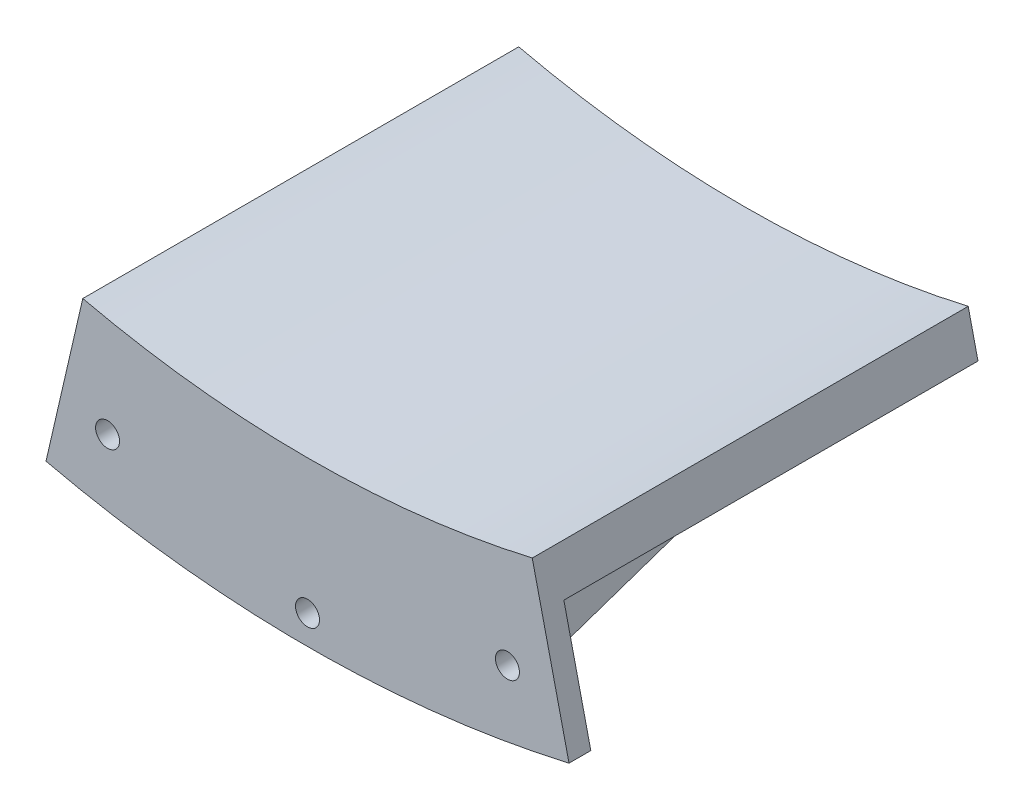
ISO-10303-21;
HEADER;
FILE_DESCRIPTION(('STEP AP214'),'2;1');
FILE_NAME('part.step','',(''),(''),'','','');
FILE_SCHEMA(('AUTOMOTIVE_DESIGN { 1 0 10303 214 1 1 1 1 }'));
ENDSEC;
DATA;
#1=APPLICATION_CONTEXT('core data for automotive mechanical design processes');
#2=APPLICATION_PROTOCOL_DEFINITION('international standard','automotive_design',2000,#1);
#3=PRODUCT_CONTEXT('',#1,'mechanical');
#4=PRODUCT('Part','Part','',(#3));
#5=PRODUCT_RELATED_PRODUCT_CATEGORY('part','',(#4));
#6=PRODUCT_DEFINITION_FORMATION('','',#4);
#7=PRODUCT_DEFINITION_CONTEXT('part definition',#1,'design');
#8=PRODUCT_DEFINITION('design','',#6,#7);
#9=PRODUCT_DEFINITION_SHAPE('','',#8);
#10=(LENGTH_UNIT() NAMED_UNIT(*) SI_UNIT(.MILLI.,.METRE.));
#11=(NAMED_UNIT(*) PLANE_ANGLE_UNIT() SI_UNIT($,.RADIAN.));
#12=(NAMED_UNIT(*) SI_UNIT($,.STERADIAN.) SOLID_ANGLE_UNIT());
#13=UNCERTAINTY_MEASURE_WITH_UNIT(LENGTH_MEASURE(1.E-05),#10,'distance_accuracy_value','');
#14=(GEOMETRIC_REPRESENTATION_CONTEXT(3) GLOBAL_UNCERTAINTY_ASSIGNED_CONTEXT((#13)) GLOBAL_UNIT_ASSIGNED_CONTEXT((#10,
#11,#12)) REPRESENTATION_CONTEXT('',''));
#15=CARTESIAN_POINT('',(0.,0.,0.));
#16=DIRECTION('',(0.,0.,1.));
#17=DIRECTION('',(1.,0.,0.));
#18=AXIS2_PLACEMENT_3D('',#15,#16,#17);
#19=CARTESIAN_POINT('',(0.,0.,60.));
#20=DIRECTION('',(0.,0.,-1.));
#21=DIRECTION('',(-1.,0.,0.));
#22=AXIS2_PLACEMENT_3D('',#19,#20,#21);
#23=CYLINDRICAL_SURFACE('',#22,143.5);
#24=DIRECTION('',(0.,0.,1.));
#25=VECTOR('',#24,1.);
#26=CARTESIAN_POINT('',(-14.5015786457528,-142.765381716931,0.));
#27=LINE('',#26,#25);
#28=CARTESIAN_POINT('',(-14.5015786457528,-142.765381716931,0.));
#29=VERTEX_POINT('',#28);
#30=CARTESIAN_POINT('',(-14.5015786457528,-142.765381716931,57.));
#31=VERTEX_POINT('',#30);
#32=EDGE_CURVE('E147',#29,#31,#27,.T.);
#33=ORIENTED_EDGE('',*,*,#32,.F.);
#34=CARTESIAN_POINT('',(0.,0.,0.));
#35=DIRECTION('',(0.,0.,1.));
#36=DIRECTION('',(1.,0.,0.));
#37=AXIS2_PLACEMENT_3D('',#34,#35,#36);
#38=CIRCLE('',#37,143.5);
#39=CARTESIAN_POINT('',(14.5015786457528,-142.765381716931,0.));
#40=VERTEX_POINT('',#39);
#41=EDGE_CURVE('E106',#29,#40,#38,.T.);
#42=ORIENTED_EDGE('',*,*,#41,.T.);
#43=DIRECTION('',(0.,0.,1.));
#44=VECTOR('',#43,1.);
#45=CARTESIAN_POINT('',(14.5015786457528,-142.765381716931,0.));
#46=LINE('',#45,#44);
#47=CARTESIAN_POINT('',(14.5015786457528,-142.765381716931,57.));
#48=VERTEX_POINT('',#47);
#49=EDGE_CURVE('E144',#40,#48,#46,.T.);
#50=ORIENTED_EDGE('',*,*,#49,.T.);
#51=CARTESIAN_POINT('',(0.,0.,57.));
#52=DIRECTION('',(0.,0.,1.));
#53=DIRECTION('',(1.,0.,0.));
#54=AXIS2_PLACEMENT_3D('',#51,#52,#53);
#55=CIRCLE('',#54,143.5);
#56=EDGE_CURVE('E182',#31,#48,#55,.T.);
#57=ORIENTED_EDGE('',*,*,#56,.F.);
#58=EDGE_LOOP('',(#33,#42,#50,#57));
#59=FACE_BOUND('',#58,.T.);
#60=ADVANCED_FACE('F36',(#59),#23,.T.);
#61=CARTESIAN_POINT('',(0.,0.,57.));
#62=DIRECTION('',(0.,0.,1.));
#63=DIRECTION('',(1.,0.,0.));
#64=AXIS2_PLACEMENT_3D('',#61,#62,#63);
#65=PLANE('',#64);
#66=CARTESIAN_POINT('',(0.,-156.,57.));
#67=DIRECTION('',(0.,0.,1.));
#68=DIRECTION('',(1.,0.,0.));
#69=AXIS2_PLACEMENT_3D('',#66,#67,#68);
#70=CIRCLE('',#69,1.65000000000001);
#71=CARTESIAN_POINT('',(1.64999999999999,-156.,57.));
#72=VERTEX_POINT('',#71);
#73=EDGE_CURVE('E249',#72,#72,#70,.T.);
#74=ORIENTED_EDGE('',*,*,#73,.T.);
#75=EDGE_LOOP('',(#74));
#76=FACE_BOUND('',#75,.T.);
#77=DIRECTION('',(-0.101056297182946,-0.994880708828788,0.));
#78=VECTOR('',#77,1.);
#79=CARTESIAN_POINT('',(0.,0.,57.));
#80=LINE('',#79,#78);
#81=CARTESIAN_POINT('',(-16.1690075492714,-159.180913412606,57.));
#82=VERTEX_POINT('',#81);
#83=EDGE_CURVE('E244',#31,#82,#80,.T.);
#84=ORIENTED_EDGE('',*,*,#83,.F.);
#85=ORIENTED_EDGE('',*,*,#56,.T.);
#86=DIRECTION('',(0.101056297182946,-0.994880708828788,0.));
#87=VECTOR('',#86,1.);
#88=CARTESIAN_POINT('',(0.,0.,57.));
#89=LINE('',#88,#87);
#90=CARTESIAN_POINT('',(16.1690075492714,-159.180913412606,57.));
#91=VERTEX_POINT('',#90);
#92=EDGE_CURVE('E159',#48,#91,#89,.T.);
#93=ORIENTED_EDGE('',*,*,#92,.T.);
#94=CARTESIAN_POINT('',(0.,0.,57.));
#95=DIRECTION('',(0.,0.,1.));
#96=DIRECTION('',(1.,0.,0.));
#97=AXIS2_PLACEMENT_3D('',#94,#95,#96);
#98=CIRCLE('',#97,160.);
#99=EDGE_CURVE('E175',#82,#91,#98,.T.);
#100=ORIENTED_EDGE('',*,*,#99,.F.);
#101=EDGE_LOOP('',(#84,#85,#93,#100));
#102=FACE_BOUND('',#101,.T.);
#103=ADVANCED_FACE('F264',(#76,#102),#65,.F.);
#104=DIRECTION('',(0.,0.,1.));
#105=VECTOR('',#104,1.);
#106=CARTESIAN_POINT('',(19.9713399877694,-142.103467864415,0.));
#107=LINE('',#106,#105);
#108=CARTESIAN_POINT('',(19.9713399877694,-142.103467864415,0.));
#109=VERTEX_POINT('',#108);
#110=CARTESIAN_POINT('',(19.9713399877694,-142.103467864415,57.));
#111=VERTEX_POINT('',#110);
#112=EDGE_CURVE('E160',#109,#111,#107,.T.);
#113=ORIENTED_EDGE('',*,*,#112,.F.);
#114=CARTESIAN_POINT('',(32.2804762983447,-139.822104296681,0.));
#115=VERTEX_POINT('',#114);
#116=EDGE_CURVE('E108',#109,#115,#38,.T.);
#117=ORIENTED_EDGE('',*,*,#116,.T.);
#118=DIRECTION('',(0.,0.,-1.));
#119=VECTOR('',#118,1.);
#120=CARTESIAN_POINT('',(32.2804762983447,-139.822104296681,60.));
#121=LINE('',#120,#119);
#122=CARTESIAN_POINT('',(32.2804762983447,-139.822104296681,57.));
#123=VERTEX_POINT('',#122);
#124=EDGE_CURVE('E83',#123,#115,#121,.T.);
#125=ORIENTED_EDGE('',*,*,#124,.F.);
#126=EDGE_CURVE('E178',#111,#123,#55,.T.);
#127=ORIENTED_EDGE('',*,*,#126,.F.);
#128=EDGE_LOOP('',(#113,#117,#125,#127));
#129=FACE_BOUND('',#128,.T.);
#130=ADVANCED_FACE('F266',(#129),#23,.T.);
#131=CARTESIAN_POINT('',(27.5175643493143,-148.471491042157,57.));
#132=DIRECTION('',(0.,0.,1.));
#133=DIRECTION('',(1.,0.,0.));
#134=AXIS2_PLACEMENT_3D('',#131,#132,#133);
#135=CIRCLE('',#134,1.64999999999998);
#136=CARTESIAN_POINT('',(29.1675643493143,-148.471491042157,57.));
#137=VERTEX_POINT('',#136);
#138=EDGE_CURVE('E245',#137,#137,#135,.T.);
#139=ORIENTED_EDGE('',*,*,#138,.T.);
#140=EDGE_LOOP('',(#139));
#141=FACE_BOUND('',#140,.T.);
#142=DIRECTION('',(0.139173100960066,-0.99026806874157,0.));
#143=VECTOR('',#142,1.);
#144=CARTESIAN_POINT('',(0.,0.,57.));
#145=LINE('',#144,#143);
#146=CARTESIAN_POINT('',(22.2676961536105,-158.442890998651,57.));
#147=VERTEX_POINT('',#146);
#148=EDGE_CURVE('E164',#111,#147,#145,.T.);
#149=ORIENTED_EDGE('',*,*,#148,.F.);
#150=ORIENTED_EDGE('',*,*,#126,.T.);
#151=DIRECTION('',(0.224951054343866,-0.974370064785235,0.));
#152=VECTOR('',#151,1.);
#153=CARTESIAN_POINT('',(0.,0.,57.));
#154=LINE('',#153,#152);
#155=CARTESIAN_POINT('',(35.9921686950185,-155.899210365638,57.));
#156=VERTEX_POINT('',#155);
#157=EDGE_CURVE('E174',#123,#156,#154,.T.);
#158=ORIENTED_EDGE('',*,*,#157,.T.);
#159=EDGE_CURVE('E170',#147,#156,#98,.T.);
#160=ORIENTED_EDGE('',*,*,#159,.F.);
#161=EDGE_LOOP('',(#149,#150,#158,#160));
#162=FACE_BOUND('',#161,.T.);
#163=ADVANCED_FACE('F262',(#141,#162),#65,.F.);
#164=CARTESIAN_POINT('',(-32.2804762983447,-139.822104296681,0.));
#165=VERTEX_POINT('',#164);
#166=CARTESIAN_POINT('',(-19.9713399877694,-142.103467864415,0.));
#167=VERTEX_POINT('',#166);
#168=EDGE_CURVE('E101',#165,#167,#38,.T.);
#169=ORIENTED_EDGE('',*,*,#168,.T.);
#170=DIRECTION('',(0.,0.,1.));
#171=VECTOR('',#170,1.);
#172=CARTESIAN_POINT('',(-19.9713399877694,-142.103467864415,0.));
#173=LINE('',#172,#171);
#174=CARTESIAN_POINT('',(-19.9713399877694,-142.103467864415,57.));
#175=VERTEX_POINT('',#174);
#176=EDGE_CURVE('E238',#167,#175,#173,.T.);
#177=ORIENTED_EDGE('',*,*,#176,.T.);
#178=CARTESIAN_POINT('',(-32.2804762983447,-139.822104296681,57.));
#179=VERTEX_POINT('',#178);
#180=EDGE_CURVE('E179',#179,#175,#55,.T.);
#181=ORIENTED_EDGE('',*,*,#180,.F.);
#182=DIRECTION('',(0.,0.,-1.));
#183=VECTOR('',#182,1.);
#184=CARTESIAN_POINT('',(-32.2804762983447,-139.822104296681,60.));
#185=LINE('',#184,#183);
#186=EDGE_CURVE('E112',#179,#165,#185,.T.);
#187=ORIENTED_EDGE('',*,*,#186,.T.);
#188=EDGE_LOOP('',(#169,#177,#181,#187));
#189=FACE_BOUND('',#188,.T.);
#190=ADVANCED_FACE('F274',(#189),#23,.T.);
#191=CARTESIAN_POINT('',(0.,0.,60.));
#192=DIRECTION('',(0.,0.,-1.));
#193=DIRECTION('',(-1.,0.,0.));
#194=AXIS2_PLACEMENT_3D('',#191,#192,#193);
#195=CYLINDRICAL_SURFACE('',#194,137.5);
#196=CARTESIAN_POINT('',(0.,0.,0.));
#197=DIRECTION('',(0.,0.,1.));
#198=DIRECTION('',(1.,0.,0.));
#199=AXIS2_PLACEMENT_3D('',#196,#197,#198);
#200=CIRCLE('',#199,137.5);
#201=CARTESIAN_POINT('',(-30.9307699722815,-133.97588390797,0.));
#202=VERTEX_POINT('',#201);
#203=CARTESIAN_POINT('',(30.9307699722815,-133.97588390797,0.));
#204=VERTEX_POINT('',#203);
#205=EDGE_CURVE('E79',#202,#204,#200,.T.);
#206=ORIENTED_EDGE('',*,*,#205,.F.);
#207=DIRECTION('',(0.,0.,-1.));
#208=VECTOR('',#207,1.);
#209=CARTESIAN_POINT('',(-30.9307699722815,-133.97588390797,60.));
#210=LINE('',#209,#208);
#211=CARTESIAN_POINT('',(-30.9307699722815,-133.97588390797,60.));
#212=VERTEX_POINT('',#211);
#213=EDGE_CURVE('E44',#212,#202,#210,.T.);
#214=ORIENTED_EDGE('',*,*,#213,.F.);
#215=CARTESIAN_POINT('',(0.,0.,60.));
#216=DIRECTION('',(0.,0.,1.));
#217=DIRECTION('',(1.,0.,0.));
#218=AXIS2_PLACEMENT_3D('',#215,#216,#217);
#219=CIRCLE('',#218,137.5);
#220=CARTESIAN_POINT('',(30.9307699722815,-133.97588390797,60.));
#221=VERTEX_POINT('',#220);
#222=EDGE_CURVE('E81',#212,#221,#219,.T.);
#223=ORIENTED_EDGE('',*,*,#222,.T.);
#224=DIRECTION('',(0.,0.,-1.));
#225=VECTOR('',#224,1.);
#226=CARTESIAN_POINT('',(30.9307699722815,-133.97588390797,60.));
#227=LINE('',#226,#225);
#228=EDGE_CURVE('E60',#221,#204,#227,.T.);
#229=ORIENTED_EDGE('',*,*,#228,.T.);
#230=EDGE_LOOP('',(#206,#214,#223,#229));
#231=FACE_BOUND('',#230,.T.);
#232=ADVANCED_FACE('F38',(#231),#195,.F.);
#233=CARTESIAN_POINT('',(0.,0.,60.));
#234=DIRECTION('',(0.974370064785235,-0.224951054343865,0.));
#235=DIRECTION('',(0.224951054343865,0.974370064785235,0.));
#236=AXIS2_PLACEMENT_3D('',#233,#234,#235);
#237=PLANE('',#236);
#238=DIRECTION('',(-0.224951054343865,-0.974370064785235,0.));
#239=VECTOR('',#238,1.);
#240=CARTESIAN_POINT('',(0.,0.,0.));
#241=LINE('',#240,#239);
#242=EDGE_CURVE('E94',#202,#165,#241,.T.);
#243=ORIENTED_EDGE('',*,*,#242,.T.);
#244=ORIENTED_EDGE('',*,*,#186,.F.);
#245=DIRECTION('',(-0.224951054343865,-0.974370064785235,0.));
#246=VECTOR('',#245,1.);
#247=CARTESIAN_POINT('',(0.,0.,57.));
#248=LINE('',#247,#246);
#249=CARTESIAN_POINT('',(-35.9921686950184,-155.899210365638,57.));
#250=VERTEX_POINT('',#249);
#251=EDGE_CURVE('E168',#179,#250,#248,.T.);
#252=ORIENTED_EDGE('',*,*,#251,.T.);
#253=DIRECTION('',(0.,0.,1.));
#254=VECTOR('',#253,1.);
#255=CARTESIAN_POINT('',(-35.9921686950184,-155.899210365638,57.));
#256=LINE('',#255,#254);
#257=CARTESIAN_POINT('',(-35.9921686950184,-155.899210365638,60.));
#258=VERTEX_POINT('',#257);
#259=EDGE_CURVE('E122',#250,#258,#256,.T.);
#260=ORIENTED_EDGE('',*,*,#259,.T.);
#261=DIRECTION('',(-0.224951054343865,-0.974370064785235,0.));
#262=VECTOR('',#261,1.);
#263=CARTESIAN_POINT('',(0.,0.,60.));
#264=LINE('',#263,#262);
#265=EDGE_CURVE('E103',#212,#258,#264,.T.);
#266=ORIENTED_EDGE('',*,*,#265,.F.);
#267=ORIENTED_EDGE('',*,*,#213,.T.);
#268=EDGE_LOOP('',(#243,#244,#252,#260,#266,#267));
#269=FACE_BOUND('',#268,.T.);
#270=ADVANCED_FACE('F115',(#269),#237,.F.);
#271=CARTESIAN_POINT('',(0.,0.,60.));
#272=DIRECTION('',(0.974370064785235,0.224951054343866,0.));
#273=DIRECTION('',(-0.224951054343866,0.974370064785235,0.));
#274=AXIS2_PLACEMENT_3D('',#271,#272,#273);
#275=PLANE('',#274);
#276=DIRECTION('',(0.224951054343866,-0.974370064785235,0.));
#277=VECTOR('',#276,1.);
#278=CARTESIAN_POINT('',(0.,0.,0.));
#279=LINE('',#278,#277);
#280=EDGE_CURVE('E91',#204,#115,#279,.T.);
#281=ORIENTED_EDGE('',*,*,#280,.F.);
#282=ORIENTED_EDGE('',*,*,#228,.F.);
#283=DIRECTION('',(0.224951054343866,-0.974370064785235,0.));
#284=VECTOR('',#283,1.);
#285=CARTESIAN_POINT('',(0.,0.,60.));
#286=LINE('',#285,#284);
#287=CARTESIAN_POINT('',(35.9921686950185,-155.899210365638,60.));
#288=VERTEX_POINT('',#287);
#289=EDGE_CURVE('E84',#221,#288,#286,.T.);
#290=ORIENTED_EDGE('',*,*,#289,.T.);
#291=DIRECTION('',(0.,0.,1.));
#292=VECTOR('',#291,1.);
#293=CARTESIAN_POINT('',(35.9921686950185,-155.899210365638,57.));
#294=LINE('',#293,#292);
#295=EDGE_CURVE('E95',#156,#288,#294,.T.);
#296=ORIENTED_EDGE('',*,*,#295,.F.);
#297=ORIENTED_EDGE('',*,*,#157,.F.);
#298=ORIENTED_EDGE('',*,*,#124,.T.);
#299=EDGE_LOOP('',(#281,#282,#290,#296,#297,#298));
#300=FACE_BOUND('',#299,.T.);
#301=ADVANCED_FACE('F98',(#300),#275,.T.);
#302=CARTESIAN_POINT('',(0.,0.,60.));
#303=DIRECTION('',(0.,0.,1.));
#304=DIRECTION('',(1.,0.,0.));
#305=AXIS2_PLACEMENT_3D('',#302,#303,#304);
#306=PLANE('',#305);
#307=CARTESIAN_POINT('',(27.5175643493143,-148.471491042157,60.));
#308=DIRECTION('',(0.,0.,-1.));
#309=DIRECTION('',(-1.,0.,0.));
#310=AXIS2_PLACEMENT_3D('',#307,#308,#309);
#311=CIRCLE('',#310,1.64999999999998);
#312=CARTESIAN_POINT('',(25.8675643493143,-148.471491042157,60.));
#313=VERTEX_POINT('',#312);
#314=EDGE_CURVE('E290',#313,#313,#311,.T.);
#315=ORIENTED_EDGE('',*,*,#314,.T.);
#316=EDGE_LOOP('',(#315));
#317=FACE_BOUND('',#316,.T.);
#318=CARTESIAN_POINT('',(0.,-156.,60.));
#319=DIRECTION('',(0.,0.,-1.));
#320=DIRECTION('',(-1.,0.,0.));
#321=AXIS2_PLACEMENT_3D('',#318,#319,#320);
#322=CIRCLE('',#321,1.65000000000001);
#323=CARTESIAN_POINT('',(-1.65000000000003,-156.,60.));
#324=VERTEX_POINT('',#323);
#325=EDGE_CURVE('E293',#324,#324,#322,.T.);
#326=ORIENTED_EDGE('',*,*,#325,.T.);
#327=EDGE_LOOP('',(#326));
#328=FACE_BOUND('',#327,.T.);
#329=CARTESIAN_POINT('',(-27.5175643493143,-148.471491042157,60.));
#330=DIRECTION('',(0.,0.,-1.));
#331=DIRECTION('',(-1.,0.,0.));
#332=AXIS2_PLACEMENT_3D('',#329,#330,#331);
#333=CIRCLE('',#332,1.64999999999997);
#334=CARTESIAN_POINT('',(-29.1675643493143,-148.471491042157,60.));
#335=VERTEX_POINT('',#334);
#336=EDGE_CURVE('E296',#335,#335,#333,.T.);
#337=ORIENTED_EDGE('',*,*,#336,.T.);
#338=EDGE_LOOP('',(#337));
#339=FACE_BOUND('',#338,.T.);
#340=ORIENTED_EDGE('',*,*,#222,.F.);
#341=ORIENTED_EDGE('',*,*,#265,.T.);
#342=CARTESIAN_POINT('',(0.,0.,60.));
#343=DIRECTION('',(0.,0.,1.));
#344=DIRECTION('',(1.,0.,0.));
#345=AXIS2_PLACEMENT_3D('',#342,#343,#344);
#346=CIRCLE('',#345,160.);
#347=EDGE_CURVE('E129',#258,#288,#346,.T.);
#348=ORIENTED_EDGE('',*,*,#347,.T.);
#349=ORIENTED_EDGE('',*,*,#289,.F.);
#350=EDGE_LOOP('',(#340,#341,#348,#349));
#351=FACE_BOUND('',#350,.T.);
#352=ADVANCED_FACE('F127',(#317,#328,#339,#351),#306,.T.);
#353=CARTESIAN_POINT('',(0.,0.,0.));
#354=DIRECTION('',(0.,0.,1.));
#355=DIRECTION('',(1.,0.,0.));
#356=AXIS2_PLACEMENT_3D('',#353,#354,#355);
#357=PLANE('',#356);
#358=ORIENTED_EDGE('',*,*,#116,.F.);
#359=CARTESIAN_POINT('',(0.,0.,0.));
#360=DIRECTION('',(0.,0.,1.));
#361=DIRECTION('',(1.,0.,0.));
#362=AXIS2_PLACEMENT_3D('',#359,#360,#361);
#363=CIRCLE('',#362,143.5);
#364=EDGE_CURVE('E304',#40,#109,#363,.T.);
#365=ORIENTED_EDGE('',*,*,#364,.F.);
#366=ORIENTED_EDGE('',*,*,#41,.F.);
#367=EDGE_CURVE('E303',#167,#29,#363,.T.);
#368=ORIENTED_EDGE('',*,*,#367,.F.);
#369=ORIENTED_EDGE('',*,*,#168,.F.);
#370=ORIENTED_EDGE('',*,*,#242,.F.);
#371=ORIENTED_EDGE('',*,*,#205,.T.);
#372=ORIENTED_EDGE('',*,*,#280,.T.);
#373=EDGE_LOOP('',(#358,#365,#366,#368,#369,#370,#371,#372));
#374=FACE_BOUND('',#373,.T.);
#375=ADVANCED_FACE('F90',(#374),#357,.F.);
#376=CARTESIAN_POINT('',(0.,0.,57.));
#377=DIRECTION('',(0.,0.,1.));
#378=DIRECTION('',(1.,0.,0.));
#379=AXIS2_PLACEMENT_3D('',#376,#377,#378);
#380=CYLINDRICAL_SURFACE('',#379,160.);
#381=CARTESIAN_POINT('',(0.,0.,57.));
#382=DIRECTION('',(0.,0.,1.));
#383=DIRECTION('',(1.,0.,0.));
#384=AXIS2_PLACEMENT_3D('',#381,#382,#383);
#385=CIRCLE('',#384,160.);
#386=EDGE_CURVE('E51',#91,#147,#385,.T.);
#387=ORIENTED_EDGE('',*,*,#386,.T.);
#388=ORIENTED_EDGE('',*,*,#159,.T.);
#389=ORIENTED_EDGE('',*,*,#295,.T.);
#390=ORIENTED_EDGE('',*,*,#347,.F.);
#391=ORIENTED_EDGE('',*,*,#259,.F.);
#392=CARTESIAN_POINT('',(-22.2676961536105,-158.442890998651,57.));
#393=VERTEX_POINT('',#392);
#394=EDGE_CURVE('E171',#250,#393,#98,.T.);
#395=ORIENTED_EDGE('',*,*,#394,.T.);
#396=EDGE_CURVE('E226',#393,#82,#385,.T.);
#397=ORIENTED_EDGE('',*,*,#396,.T.);
#398=ORIENTED_EDGE('',*,*,#99,.T.);
#399=EDGE_LOOP('',(#387,#388,#389,#390,#391,#395,#397,#398));
#400=FACE_BOUND('',#399,.T.);
#401=ADVANCED_FACE('F187',(#400),#380,.T.);
#402=CARTESIAN_POINT('',(-27.5175643493143,-148.471491042157,57.));
#403=DIRECTION('',(0.,0.,1.));
#404=DIRECTION('',(1.,0.,0.));
#405=AXIS2_PLACEMENT_3D('',#402,#403,#404);
#406=CIRCLE('',#405,1.64999999999997);
#407=CARTESIAN_POINT('',(-25.8675643493143,-148.471491042157,57.));
#408=VERTEX_POINT('',#407);
#409=EDGE_CURVE('E288',#408,#408,#406,.T.);
#410=ORIENTED_EDGE('',*,*,#409,.T.);
#411=EDGE_LOOP('',(#410));
#412=FACE_BOUND('',#411,.T.);
#413=ORIENTED_EDGE('',*,*,#180,.T.);
#414=DIRECTION('',(-0.139173100960066,-0.99026806874157,0.));
#415=VECTOR('',#414,1.);
#416=CARTESIAN_POINT('',(0.,0.,57.));
#417=LINE('',#416,#415);
#418=EDGE_CURVE('E236',#175,#393,#417,.T.);
#419=ORIENTED_EDGE('',*,*,#418,.T.);
#420=ORIENTED_EDGE('',*,*,#394,.F.);
#421=ORIENTED_EDGE('',*,*,#251,.F.);
#422=EDGE_LOOP('',(#413,#419,#420,#421));
#423=FACE_BOUND('',#422,.T.);
#424=ADVANCED_FACE('F242',(#412,#423),#65,.F.);
#425=CARTESIAN_POINT('',(0.,0.,0.));
#426=DIRECTION('',(-0.99026806874157,-0.139173100960066,0.));
#427=DIRECTION('',(0.139173100960066,-0.99026806874157,0.));
#428=AXIS2_PLACEMENT_3D('',#425,#426,#427);
#429=PLANE('',#428);
#430=ORIENTED_EDGE('',*,*,#148,.T.);
#431=DIRECTION('',(0.0386982047592103,-0.275352034454309,0.960564264414561));
#432=VECTOR('',#431,1.);
#433=CARTESIAN_POINT('',(0.,0.,-495.727272727272));
#434=LINE('',#433,#432);
#435=EDGE_CURVE('E259',#147,#109,#434,.F.);
#436=ORIENTED_EDGE('',*,*,#435,.T.);
#437=ORIENTED_EDGE('',*,*,#112,.T.);
#438=EDGE_LOOP('',(#430,#436,#437));
#439=FACE_BOUND('',#438,.T.);
#440=ADVANCED_FACE('F258',(#439),#429,.F.);
#441=CARTESIAN_POINT('',(0.,0.,0.));
#442=DIRECTION('',(-0.994880708828788,-0.101056297182946,0.));
#443=DIRECTION('',(0.101056297182946,-0.994880708828788,0.));
#444=AXIS2_PLACEMENT_3D('',#441,#442,#443);
#445=PLANE('',#444);
#446=DIRECTION('',(0.0280995196170516,-0.276634616284737,0.960564264414561));
#447=VECTOR('',#446,1.);
#448=CARTESIAN_POINT('',(0.,0.,-495.727272727272));
#449=LINE('',#448,#447);
#450=EDGE_CURVE('E156',#91,#40,#449,.F.);
#451=ORIENTED_EDGE('',*,*,#450,.F.);
#452=ORIENTED_EDGE('',*,*,#92,.F.);
#453=ORIENTED_EDGE('',*,*,#49,.F.);
#454=EDGE_LOOP('',(#451,#452,#453));
#455=FACE_BOUND('',#454,.T.);
#456=ADVANCED_FACE('F155',(#455),#445,.T.);
#457=CARTESIAN_POINT('',(0.,0.,0.));
#458=DIRECTION('',(-0.99026806874157,0.139173100960066,0.));
#459=DIRECTION('',(-0.139173100960066,-0.99026806874157,0.));
#460=AXIS2_PLACEMENT_3D('',#457,#458,#459);
#461=PLANE('',#460);
#462=DIRECTION('',(-0.0386982047592103,-0.275352034454309,0.960564264414561));
#463=VECTOR('',#462,1.);
#464=CARTESIAN_POINT('',(0.,0.,-495.727272727272));
#465=LINE('',#464,#463);
#466=EDGE_CURVE('E229',#393,#167,#465,.F.);
#467=ORIENTED_EDGE('',*,*,#466,.F.);
#468=ORIENTED_EDGE('',*,*,#418,.F.);
#469=ORIENTED_EDGE('',*,*,#176,.F.);
#470=EDGE_LOOP('',(#467,#468,#469));
#471=FACE_BOUND('',#470,.T.);
#472=ADVANCED_FACE('F235',(#471),#461,.T.);
#473=CARTESIAN_POINT('',(0.,0.,0.));
#474=DIRECTION('',(-0.994880708828788,0.101056297182946,0.));
#475=DIRECTION('',(-0.101056297182946,-0.994880708828788,0.));
#476=AXIS2_PLACEMENT_3D('',#473,#474,#475);
#477=PLANE('',#476);
#478=ORIENTED_EDGE('',*,*,#83,.T.);
#479=DIRECTION('',(-0.0280995196170516,-0.276634616284737,0.960564264414561));
#480=VECTOR('',#479,1.);
#481=CARTESIAN_POINT('',(0.,0.,-495.727272727272));
#482=LINE('',#481,#480);
#483=EDGE_CURVE('E11',#82,#29,#482,.F.);
#484=ORIENTED_EDGE('',*,*,#483,.T.);
#485=ORIENTED_EDGE('',*,*,#32,.T.);
#486=EDGE_LOOP('',(#478,#484,#485));
#487=FACE_BOUND('',#486,.T.);
#488=ADVANCED_FACE('F306',(#487),#477,.F.);
#489=CARTESIAN_POINT('',(-27.5175643493143,-148.471491042157,60.));
#490=DIRECTION('',(0.,0.,-1.));
#491=DIRECTION('',(-1.,0.,0.));
#492=AXIS2_PLACEMENT_3D('',#489,#490,#491);
#493=CYLINDRICAL_SURFACE('',#492,1.64999999999997);
#494=ORIENTED_EDGE('',*,*,#336,.F.);
#495=EDGE_LOOP('',(#494));
#496=FACE_BOUND('',#495,.T.);
#497=ORIENTED_EDGE('',*,*,#409,.F.);
#498=EDGE_LOOP('',(#497));
#499=FACE_BOUND('',#498,.T.);
#500=ADVANCED_FACE('F308',(#496,#499),#493,.F.);
#501=CARTESIAN_POINT('',(0.,-156.,60.));
#502=DIRECTION('',(0.,0.,-1.));
#503=DIRECTION('',(-1.,0.,0.));
#504=AXIS2_PLACEMENT_3D('',#501,#502,#503);
#505=CYLINDRICAL_SURFACE('',#504,1.65000000000001);
#506=ORIENTED_EDGE('',*,*,#325,.F.);
#507=EDGE_LOOP('',(#506));
#508=FACE_BOUND('',#507,.T.);
#509=ORIENTED_EDGE('',*,*,#73,.F.);
#510=EDGE_LOOP('',(#509));
#511=FACE_BOUND('',#510,.T.);
#512=ADVANCED_FACE('F314',(#508,#511),#505,.F.);
#513=CARTESIAN_POINT('',(27.5175643493143,-148.471491042157,60.));
#514=DIRECTION('',(0.,0.,-1.));
#515=DIRECTION('',(-1.,0.,0.));
#516=AXIS2_PLACEMENT_3D('',#513,#514,#515);
#517=CYLINDRICAL_SURFACE('',#516,1.64999999999998);
#518=ORIENTED_EDGE('',*,*,#314,.F.);
#519=EDGE_LOOP('',(#518));
#520=FACE_BOUND('',#519,.T.);
#521=ORIENTED_EDGE('',*,*,#138,.F.);
#522=EDGE_LOOP('',(#521));
#523=FACE_BOUND('',#522,.T.);
#524=ADVANCED_FACE('F344',(#520,#523),#517,.F.);
#525=CARTESIAN_POINT('',(0.,0.,0.));
#526=DIRECTION('',(0.,0.,1.));
#527=DIRECTION('',(1.,0.,0.));
#528=AXIS2_PLACEMENT_3D('',#525,#526,#527);
#529=CONICAL_SURFACE('',#528,143.5,0.281771867273352);
#530=ORIENTED_EDGE('',*,*,#466,.T.);
#531=ORIENTED_EDGE('',*,*,#367,.T.);
#532=ORIENTED_EDGE('',*,*,#483,.F.);
#533=ORIENTED_EDGE('',*,*,#396,.F.);
#534=EDGE_LOOP('',(#530,#531,#532,#533));
#535=FACE_BOUND('',#534,.T.);
#536=ADVANCED_FACE('F228',(#535),#529,.T.);
#537=ORIENTED_EDGE('',*,*,#386,.F.);
#538=ORIENTED_EDGE('',*,*,#450,.T.);
#539=ORIENTED_EDGE('',*,*,#364,.T.);
#540=ORIENTED_EDGE('',*,*,#435,.F.);
#541=EDGE_LOOP('',(#537,#538,#539,#540));
#542=FACE_BOUND('',#541,.T.);
#543=ADVANCED_FACE('F343',(#542),#529,.T.);
#544=CLOSED_SHELL('',(#60,#103,#130,#163,#190,#232,#270,#301,#352,#375,#401,#424,#440,#456,#472,
#488,#500,#512,#524,#536,#543));
#545=MANIFOLD_SOLID_BREP('B2',#544);
#546=ADVANCED_BREP_SHAPE_REPRESENTATION('',(#18,#545),#14);
#547=SHAPE_DEFINITION_REPRESENTATION(#9,#546);
ENDSEC;
END-ISO-10303-21;
